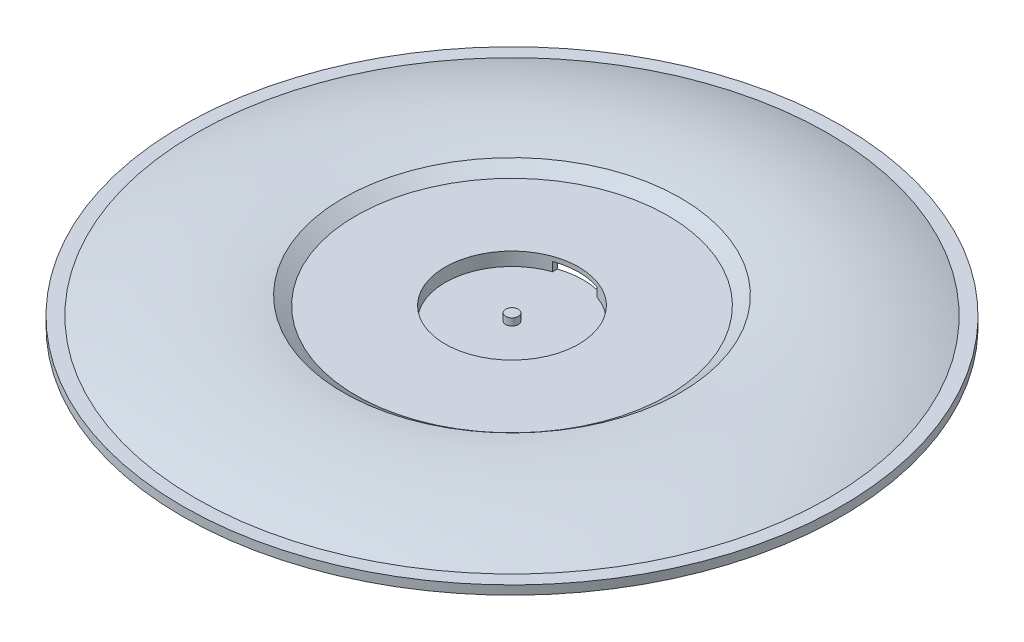
ISO-10303-21;
HEADER;
FILE_DESCRIPTION(('STEP AP214'),'2;1');
FILE_NAME('part.step','',(''),(''),'','','');
FILE_SCHEMA(('AUTOMOTIVE_DESIGN { 1 0 10303 214 1 1 1 1 }'));
ENDSEC;
DATA;
#1=APPLICATION_CONTEXT('core data for automotive mechanical design processes');
#2=APPLICATION_PROTOCOL_DEFINITION('international standard','automotive_design',2000,#1);
#3=PRODUCT_CONTEXT('',#1,'mechanical');
#4=PRODUCT('Part','Part','',(#3));
#5=PRODUCT_RELATED_PRODUCT_CATEGORY('part','',(#4));
#6=PRODUCT_DEFINITION_FORMATION('','',#4);
#7=PRODUCT_DEFINITION_CONTEXT('part definition',#1,'design');
#8=PRODUCT_DEFINITION('design','',#6,#7);
#9=PRODUCT_DEFINITION_SHAPE('','',#8);
#10=(LENGTH_UNIT() NAMED_UNIT(*) SI_UNIT(.MILLI.,.METRE.));
#11=(NAMED_UNIT(*) PLANE_ANGLE_UNIT() SI_UNIT($,.RADIAN.));
#12=(NAMED_UNIT(*) SI_UNIT($,.STERADIAN.) SOLID_ANGLE_UNIT());
#13=UNCERTAINTY_MEASURE_WITH_UNIT(LENGTH_MEASURE(1.E-05),#10,'distance_accuracy_value','');
#14=(GEOMETRIC_REPRESENTATION_CONTEXT(3) GLOBAL_UNCERTAINTY_ASSIGNED_CONTEXT((#13)) GLOBAL_UNIT_ASSIGNED_CONTEXT((#10,
#11,#12)) REPRESENTATION_CONTEXT('',''));
#15=CARTESIAN_POINT('',(0.,0.,0.));
#16=DIRECTION('',(0.,0.,1.));
#17=DIRECTION('',(1.,0.,0.));
#18=AXIS2_PLACEMENT_3D('',#15,#16,#17);
#19=CARTESIAN_POINT('',(0.,0.5,0.));
#20=DIRECTION('',(0.,1.,0.));
#21=DIRECTION('',(0.,0.,1.));
#22=AXIS2_PLACEMENT_3D('',#19,#20,#21);
#23=PLANE('',#22);
#24=CARTESIAN_POINT('',(0.,0.5,0.));
#25=DIRECTION('',(0.,1.,0.));
#26=DIRECTION('',(0.,0.,1.));
#27=AXIS2_PLACEMENT_3D('',#24,#25,#26);
#28=CIRCLE('',#27,0.7);
#29=CARTESIAN_POINT('',(0.,0.5,0.7));
#30=VERTEX_POINT('',#29);
#31=EDGE_CURVE('E11',#30,#30,#28,.T.);
#32=ORIENTED_EDGE('',*,*,#31,.F.);
#33=EDGE_LOOP('',(#32));
#34=FACE_BOUND('',#33,.T.);
#35=CARTESIAN_POINT('',(0.,0.5,0.));
#36=DIRECTION('',(0.,-1.,0.));
#37=DIRECTION('',(0.,0.,-1.));
#38=AXIS2_PLACEMENT_3D('',#35,#36,#37);
#39=CIRCLE('',#38,7.5);
#40=CARTESIAN_POINT('',(-2.50000000000001,0.5,7.07106781186549));
#41=VERTEX_POINT('',#40);
#42=CARTESIAN_POINT('',(-2.50000000000001,0.5,-7.07106781186549));
#43=VERTEX_POINT('',#42);
#44=EDGE_CURVE('E179',#41,#43,#39,.T.);
#45=ORIENTED_EDGE('',*,*,#44,.F.);
#46=DIRECTION('',(0.,0.,1.));
#47=VECTOR('',#46,1.);
#48=CARTESIAN_POINT('',(-2.5,0.5,-15.));
#49=LINE('',#48,#47);
#50=CARTESIAN_POINT('',(-2.5,0.5,7.59934207678534));
#51=VERTEX_POINT('',#50);
#52=EDGE_CURVE('E214',#41,#51,#49,.T.);
#53=ORIENTED_EDGE('',*,*,#52,.T.);
#54=CARTESIAN_POINT('',(0.,0.5,0.));
#55=DIRECTION('',(0.,-1.,0.));
#56=DIRECTION('',(0.,0.,-1.));
#57=AXIS2_PLACEMENT_3D('',#54,#55,#56);
#58=CIRCLE('',#57,8.);
#59=CARTESIAN_POINT('',(2.50000000000001,0.5,7.59934207678534));
#60=VERTEX_POINT('',#59);
#61=EDGE_CURVE('E187',#51,#60,#58,.F.);
#62=ORIENTED_EDGE('',*,*,#61,.T.);
#63=DIRECTION('',(0.,0.,1.));
#64=VECTOR('',#63,1.);
#65=CARTESIAN_POINT('',(2.5,0.5,-15.));
#66=LINE('',#65,#64);
#67=CARTESIAN_POINT('',(2.50000000000001,0.5,7.07106781186549));
#68=VERTEX_POINT('',#67);
#69=EDGE_CURVE('E213',#68,#60,#66,.T.);
#70=ORIENTED_EDGE('',*,*,#69,.F.);
#71=CARTESIAN_POINT('',(2.50000000000001,0.5,-7.07106781186549));
#72=VERTEX_POINT('',#71);
#73=EDGE_CURVE('E180',#72,#68,#39,.T.);
#74=ORIENTED_EDGE('',*,*,#73,.F.);
#75=CARTESIAN_POINT('',(2.5,0.5,-7.59934207678534));
#76=VERTEX_POINT('',#75);
#77=EDGE_CURVE('E208',#76,#72,#66,.T.);
#78=ORIENTED_EDGE('',*,*,#77,.F.);
#79=CARTESIAN_POINT('',(-2.50000000000001,0.5,-7.59934207678534));
#80=VERTEX_POINT('',#79);
#81=EDGE_CURVE('E119',#76,#80,#58,.F.);
#82=ORIENTED_EDGE('',*,*,#81,.T.);
#83=EDGE_CURVE('E205',#80,#43,#49,.T.);
#84=ORIENTED_EDGE('',*,*,#83,.T.);
#85=EDGE_LOOP('',(#45,#53,#62,#70,#74,#78,#82,#84));
#86=FACE_BOUND('',#85,.T.);
#87=ADVANCED_FACE('F40',(#34,#86),#23,.T.);
#88=CARTESIAN_POINT('',(0.,0.,0.));
#89=DIRECTION('',(0.,-1.,0.));
#90=DIRECTION('',(0.,0.,-1.));
#91=AXIS2_PLACEMENT_3D('',#88,#89,#90);
#92=CYLINDRICAL_SURFACE('',#91,7.5);
#93=DIRECTION('',(0.,-1.,0.));
#94=VECTOR('',#93,1.);
#95=CARTESIAN_POINT('',(2.50000000000001,0.,-7.07106781186549));
#96=LINE('',#95,#94);
#97=CARTESIAN_POINT('',(2.50000000000001,1.5,-7.07106781186549));
#98=VERTEX_POINT('',#97);
#99=EDGE_CURVE('E106',#72,#98,#96,.F.);
#100=ORIENTED_EDGE('',*,*,#99,.F.);
#101=ORIENTED_EDGE('',*,*,#73,.T.);
#102=DIRECTION('',(0.,-1.,0.));
#103=VECTOR('',#102,1.);
#104=CARTESIAN_POINT('',(2.50000000000001,0.,7.07106781186549));
#105=LINE('',#104,#103);
#106=CARTESIAN_POINT('',(2.50000000000001,1.5,7.07106781186549));
#107=VERTEX_POINT('',#106);
#108=EDGE_CURVE('E239',#107,#68,#105,.T.);
#109=ORIENTED_EDGE('',*,*,#108,.F.);
#110=CARTESIAN_POINT('',(0.,1.5,0.));
#111=DIRECTION('',(0.,1.,0.));
#112=DIRECTION('',(0.,0.,1.));
#113=AXIS2_PLACEMENT_3D('',#110,#111,#112);
#114=CIRCLE('',#113,7.5);
#115=CARTESIAN_POINT('',(-2.50000000000001,1.5,7.07106781186549));
#116=VERTEX_POINT('',#115);
#117=EDGE_CURVE('E230',#116,#107,#114,.T.);
#118=ORIENTED_EDGE('',*,*,#117,.F.);
#119=DIRECTION('',(0.,-1.,0.));
#120=VECTOR('',#119,1.);
#121=CARTESIAN_POINT('',(-2.50000000000001,0.,7.07106781186549));
#122=LINE('',#121,#120);
#123=EDGE_CURVE('E233',#41,#116,#122,.F.);
#124=ORIENTED_EDGE('',*,*,#123,.F.);
#125=ORIENTED_EDGE('',*,*,#44,.T.);
#126=DIRECTION('',(0.,-1.,0.));
#127=VECTOR('',#126,1.);
#128=CARTESIAN_POINT('',(-2.50000000000001,0.,-7.07106781186549));
#129=LINE('',#128,#127);
#130=CARTESIAN_POINT('',(-2.50000000000001,1.5,-7.07106781186549));
#131=VERTEX_POINT('',#130);
#132=EDGE_CURVE('E211',#131,#43,#129,.T.);
#133=ORIENTED_EDGE('',*,*,#132,.F.);
#134=EDGE_CURVE('E219',#98,#131,#114,.T.);
#135=ORIENTED_EDGE('',*,*,#134,.F.);
#136=EDGE_LOOP('',(#100,#101,#109,#118,#124,#125,#133,#135));
#137=FACE_BOUND('',#136,.T.);
#138=CARTESIAN_POINT('',(0.,2.,0.));
#139=DIRECTION('',(0.,-1.,0.));
#140=DIRECTION('',(0.,0.,-1.));
#141=AXIS2_PLACEMENT_3D('',#138,#139,#140);
#142=CIRCLE('',#141,7.5);
#143=CARTESIAN_POINT('',(0.,2.,-7.5));
#144=VERTEX_POINT('',#143);
#145=EDGE_CURVE('E175',#144,#144,#142,.T.);
#146=ORIENTED_EDGE('',*,*,#145,.F.);
#147=EDGE_LOOP('',(#146));
#148=FACE_BOUND('',#147,.T.);
#149=ADVANCED_FACE('F263',(#137,#148),#92,.F.);
#150=CARTESIAN_POINT('',(7.50000000000001,2.,0.));
#151=DIRECTION('',(0.,1.,0.));
#152=DIRECTION('',(0.,0.,1.));
#153=AXIS2_PLACEMENT_3D('',#150,#151,#152);
#154=PLANE('',#153);
#155=ORIENTED_EDGE('',*,*,#145,.T.);
#156=EDGE_LOOP('',(#155));
#157=FACE_BOUND('',#156,.T.);
#158=CARTESIAN_POINT('',(0.,2.,0.));
#159=DIRECTION('',(0.,-1.,0.));
#160=DIRECTION('',(0.,0.,-1.));
#161=AXIS2_PLACEMENT_3D('',#158,#159,#160);
#162=CIRCLE('',#161,17.5);
#163=CARTESIAN_POINT('',(0.,2.,-17.5));
#164=VERTEX_POINT('',#163);
#165=EDGE_CURVE('E171',#164,#164,#162,.T.);
#166=ORIENTED_EDGE('',*,*,#165,.F.);
#167=EDGE_LOOP('',(#166));
#168=FACE_BOUND('',#167,.T.);
#169=ADVANCED_FACE('F268',(#157,#168),#154,.T.);
#170=CARTESIAN_POINT('',(0.,3.,0.));
#171=DIRECTION('',(0.,1.,0.));
#172=DIRECTION('',(0.,0.,1.));
#173=AXIS2_PLACEMENT_3D('',#170,#171,#172);
#174=CONICAL_SURFACE('',#173,18.9281480067421,0.95993108859688);
#175=ORIENTED_EDGE('',*,*,#165,.T.);
#176=EDGE_LOOP('',(#175));
#177=FACE_BOUND('',#176,.T.);
#178=CARTESIAN_POINT('',(0.,3.,0.));
#179=DIRECTION('',(0.,-1.,0.));
#180=DIRECTION('',(0.,0.,-1.));
#181=AXIS2_PLACEMENT_3D('',#178,#179,#180);
#182=CIRCLE('',#181,18.9281480067421);
#183=CARTESIAN_POINT('',(0.,3.,-18.9281480067421));
#184=VERTEX_POINT('',#183);
#185=EDGE_CURVE('E167',#184,#184,#182,.T.);
#186=ORIENTED_EDGE('',*,*,#185,.F.);
#187=EDGE_LOOP('',(#186));
#188=FACE_BOUND('',#187,.T.);
#189=ADVANCED_FACE('F447',(#177,#188),#174,.F.);
#190=CARTESIAN_POINT('',(0.,-29.6971542186464,0.));
#191=DIRECTION('',(0.,-1.,0.));
#192=DIRECTION('',(0.,0.,-1.));
#193=AXIS2_PLACEMENT_3D('',#190,#191,#192);
#194=DEGENERATE_TOROIDAL_SURFACE('',#193,23.3886531353182,33.,.T.);
#195=ORIENTED_EDGE('',*,*,#185,.T.);
#196=EDGE_LOOP('',(#195));
#197=FACE_BOUND('',#196,.T.);
#198=CARTESIAN_POINT('',(0.,1.00000000000001,0.));
#199=DIRECTION('',(0.,-1.,0.));
#200=DIRECTION('',(0.,0.,-1.));
#201=AXIS2_PLACEMENT_3D('',#198,#199,#200);
#202=CIRCLE('',#201,35.5);
#203=CARTESIAN_POINT('',(0.,1.00000000000001,-35.5));
#204=VERTEX_POINT('',#203);
#205=EDGE_CURVE('E163',#204,#204,#202,.T.);
#206=ORIENTED_EDGE('',*,*,#205,.F.);
#207=EDGE_LOOP('',(#206));
#208=FACE_BOUND('',#207,.T.);
#209=ADVANCED_FACE('F437',(#197,#208),#194,.T.);
#210=CARTESIAN_POINT('',(35.5000000000001,1.,0.));
#211=DIRECTION('',(0.,1.,0.));
#212=DIRECTION('',(0.,0.,1.));
#213=AXIS2_PLACEMENT_3D('',#210,#211,#212);
#214=PLANE('',#213);
#215=ORIENTED_EDGE('',*,*,#205,.T.);
#216=EDGE_LOOP('',(#215));
#217=FACE_BOUND('',#216,.T.);
#218=CARTESIAN_POINT('',(0.,1.,0.));
#219=DIRECTION('',(0.,-1.,0.));
#220=DIRECTION('',(0.,0.,-1.));
#221=AXIS2_PLACEMENT_3D('',#218,#219,#220);
#222=CIRCLE('',#221,37.);
#223=CARTESIAN_POINT('',(0.,1.,-37.));
#224=VERTEX_POINT('',#223);
#225=EDGE_CURVE('E159',#224,#224,#222,.T.);
#226=ORIENTED_EDGE('',*,*,#225,.F.);
#227=EDGE_LOOP('',(#226));
#228=FACE_BOUND('',#227,.T.);
#229=ADVANCED_FACE('F427',(#217,#228),#214,.T.);
#230=CARTESIAN_POINT('',(0.,0.,0.));
#231=DIRECTION('',(0.,-1.,0.));
#232=DIRECTION('',(0.,0.,-1.));
#233=AXIS2_PLACEMENT_3D('',#230,#231,#232);
#234=CYLINDRICAL_SURFACE('',#233,37.);
#235=ORIENTED_EDGE('',*,*,#225,.T.);
#236=EDGE_LOOP('',(#235));
#237=FACE_BOUND('',#236,.T.);
#238=CARTESIAN_POINT('',(0.,0.,0.));
#239=DIRECTION('',(0.,-1.,0.));
#240=DIRECTION('',(0.,0.,-1.));
#241=AXIS2_PLACEMENT_3D('',#238,#239,#240);
#242=CIRCLE('',#241,37.);
#243=CARTESIAN_POINT('',(0.,0.,-37.));
#244=VERTEX_POINT('',#243);
#245=EDGE_CURVE('E155',#244,#244,#242,.T.);
#246=ORIENTED_EDGE('',*,*,#245,.F.);
#247=EDGE_LOOP('',(#246));
#248=FACE_BOUND('',#247,.T.);
#249=ADVANCED_FACE('F417',(#237,#248),#234,.T.);
#250=CARTESIAN_POINT('',(37.,0.,0.));
#251=DIRECTION('',(0.,-1.,0.));
#252=DIRECTION('',(0.,0.,-1.));
#253=AXIS2_PLACEMENT_3D('',#250,#251,#252);
#254=PLANE('',#253);
#255=ORIENTED_EDGE('',*,*,#245,.T.);
#256=EDGE_LOOP('',(#255));
#257=FACE_BOUND('',#256,.T.);
#258=CARTESIAN_POINT('',(0.,0.,0.));
#259=DIRECTION('',(0.,-1.,0.));
#260=DIRECTION('',(0.,0.,-1.));
#261=AXIS2_PLACEMENT_3D('',#258,#259,#260);
#262=CIRCLE('',#261,36.5);
#263=CARTESIAN_POINT('',(0.,0.,-36.5));
#264=VERTEX_POINT('',#263);
#265=EDGE_CURVE('E151',#264,#264,#262,.T.);
#266=ORIENTED_EDGE('',*,*,#265,.F.);
#267=EDGE_LOOP('',(#266));
#268=FACE_BOUND('',#267,.T.);
#269=ADVANCED_FACE('F407',(#257,#268),#254,.T.);
#270=CARTESIAN_POINT('',(0.,0.,0.));
#271=DIRECTION('',(0.,-1.,0.));
#272=DIRECTION('',(0.,0.,-1.));
#273=AXIS2_PLACEMENT_3D('',#270,#271,#272);
#274=CYLINDRICAL_SURFACE('',#273,36.5);
#275=ORIENTED_EDGE('',*,*,#265,.T.);
#276=EDGE_LOOP('',(#275));
#277=FACE_BOUND('',#276,.T.);
#278=CARTESIAN_POINT('',(0.,0.5,0.));
#279=DIRECTION('',(0.,-1.,0.));
#280=DIRECTION('',(0.,0.,-1.));
#281=AXIS2_PLACEMENT_3D('',#278,#279,#280);
#282=CIRCLE('',#281,36.5);
#283=CARTESIAN_POINT('',(0.,0.5,-36.5));
#284=VERTEX_POINT('',#283);
#285=EDGE_CURVE('E147',#284,#284,#282,.T.);
#286=ORIENTED_EDGE('',*,*,#285,.F.);
#287=EDGE_LOOP('',(#286));
#288=FACE_BOUND('',#287,.T.);
#289=ADVANCED_FACE('F397',(#277,#288),#274,.F.);
#290=CARTESIAN_POINT('',(35.404554145866,0.5,0.));
#291=DIRECTION('',(0.,-1.,0.));
#292=DIRECTION('',(0.,0.,-1.));
#293=AXIS2_PLACEMENT_3D('',#290,#291,#292);
#294=PLANE('',#293);
#295=ORIENTED_EDGE('',*,*,#285,.T.);
#296=EDGE_LOOP('',(#295));
#297=FACE_BOUND('',#296,.T.);
#298=CARTESIAN_POINT('',(0.,0.5,0.));
#299=DIRECTION('',(0.,-1.,0.));
#300=DIRECTION('',(0.,0.,-1.));
#301=AXIS2_PLACEMENT_3D('',#298,#299,#300);
#302=CIRCLE('',#301,35.404554145866);
#303=CARTESIAN_POINT('',(0.,0.5,-35.404554145866));
#304=VERTEX_POINT('',#303);
#305=EDGE_CURVE('E143',#304,#304,#302,.T.);
#306=ORIENTED_EDGE('',*,*,#305,.F.);
#307=EDGE_LOOP('',(#306));
#308=FACE_BOUND('',#307,.T.);
#309=ADVANCED_FACE('F387',(#297,#308),#294,.T.);
#310=CARTESIAN_POINT('',(0.,-29.6971542186464,0.));
#311=DIRECTION('',(0.,-1.,0.));
#312=DIRECTION('',(0.,0.,-1.));
#313=AXIS2_PLACEMENT_3D('',#310,#311,#312);
#314=DEGENERATE_TOROIDAL_SURFACE('',#313,23.3886531353182,32.5,.T.);
#315=ORIENTED_EDGE('',*,*,#305,.T.);
#316=EDGE_LOOP('',(#315));
#317=FACE_BOUND('',#316,.T.);
#318=CARTESIAN_POINT('',(0.,2.52067771160669,0.));
#319=DIRECTION('',(0.,-1.,0.));
#320=DIRECTION('',(0.,0.,-1.));
#321=AXIS2_PLACEMENT_3D('',#318,#319,#320);
#322=CIRCLE('',#321,19.1153282337967);
#323=CARTESIAN_POINT('',(0.,2.52067771160669,-19.1153282337967));
#324=VERTEX_POINT('',#323);
#325=EDGE_CURVE('E133',#324,#324,#322,.T.);
#326=ORIENTED_EDGE('',*,*,#325,.F.);
#327=EDGE_LOOP('',(#326));
#328=FACE_BOUND('',#327,.T.);
#329=ADVANCED_FACE('F378',(#317,#328),#314,.F.);
#330=CARTESIAN_POINT('',(0.,1.5,0.));
#331=DIRECTION('',(0.,1.,0.));
#332=DIRECTION('',(0.,0.,1.));
#333=AXIS2_PLACEMENT_3D('',#330,#331,#332);
#334=CONICAL_SURFACE('',#333,17.6576493944395,0.959931088596881);
#335=ORIENTED_EDGE('',*,*,#325,.T.);
#336=EDGE_LOOP('',(#335));
#337=FACE_BOUND('',#336,.T.);
#338=CARTESIAN_POINT('',(0.,1.5,0.));
#339=DIRECTION('',(0.,-1.,0.));
#340=DIRECTION('',(0.,0.,-1.));
#341=AXIS2_PLACEMENT_3D('',#338,#339,#340);
#342=CIRCLE('',#341,17.6576493944395);
#343=CARTESIAN_POINT('',(0.,1.5,-17.6576493944395));
#344=VERTEX_POINT('',#343);
#345=EDGE_CURVE('E126',#344,#344,#342,.T.);
#346=ORIENTED_EDGE('',*,*,#345,.F.);
#347=EDGE_LOOP('',(#346));
#348=FACE_BOUND('',#347,.T.);
#349=ADVANCED_FACE('F260',(#337,#348),#334,.T.);
#350=CARTESIAN_POINT('',(8.,1.5,0.));
#351=DIRECTION('',(0.,-1.,0.));
#352=DIRECTION('',(0.,0.,-1.));
#353=AXIS2_PLACEMENT_3D('',#350,#351,#352);
#354=PLANE('',#353);
#355=CARTESIAN_POINT('',(0.,1.5,0.));
#356=DIRECTION('',(0.,-1.,0.));
#357=DIRECTION('',(0.,0.,-1.));
#358=AXIS2_PLACEMENT_3D('',#355,#356,#357);
#359=CIRCLE('',#358,8.);
#360=CARTESIAN_POINT('',(2.5,1.5,-7.59934207678534));
#361=VERTEX_POINT('',#360);
#362=CARTESIAN_POINT('',(2.50000000000001,1.5,7.59934207678534));
#363=VERTEX_POINT('',#362);
#364=EDGE_CURVE('E117',#361,#363,#359,.T.);
#365=ORIENTED_EDGE('',*,*,#364,.F.);
#366=DIRECTION('',(0.,0.,1.));
#367=VECTOR('',#366,1.);
#368=CARTESIAN_POINT('',(2.50000000000001,1.5,-15.));
#369=LINE('',#368,#367);
#370=EDGE_CURVE('E55',#361,#98,#369,.T.);
#371=ORIENTED_EDGE('',*,*,#370,.T.);
#372=ORIENTED_EDGE('',*,*,#134,.T.);
#373=DIRECTION('',(0.,0.,1.));
#374=VECTOR('',#373,1.);
#375=CARTESIAN_POINT('',(-2.5,1.5,-15.));
#376=LINE('',#375,#374);
#377=CARTESIAN_POINT('',(-2.50000000000001,1.5,-7.59934207678534));
#378=VERTEX_POINT('',#377);
#379=EDGE_CURVE('E218',#378,#131,#376,.T.);
#380=ORIENTED_EDGE('',*,*,#379,.F.);
#381=CARTESIAN_POINT('',(-2.5,1.5,7.59934207678534));
#382=VERTEX_POINT('',#381);
#383=EDGE_CURVE('E127',#382,#378,#359,.T.);
#384=ORIENTED_EDGE('',*,*,#383,.F.);
#385=EDGE_CURVE('E62',#116,#382,#376,.T.);
#386=ORIENTED_EDGE('',*,*,#385,.F.);
#387=ORIENTED_EDGE('',*,*,#117,.T.);
#388=EDGE_CURVE('E109',#107,#363,#369,.T.);
#389=ORIENTED_EDGE('',*,*,#388,.T.);
#390=EDGE_LOOP('',(#365,#371,#372,#380,#384,#386,#387,#389));
#391=FACE_BOUND('',#390,.T.);
#392=ORIENTED_EDGE('',*,*,#345,.T.);
#393=EDGE_LOOP('',(#392));
#394=FACE_BOUND('',#393,.T.);
#395=ADVANCED_FACE('F121',(#391,#394),#354,.T.);
#396=CARTESIAN_POINT('',(0.,0.,0.));
#397=DIRECTION('',(0.,-1.,0.));
#398=DIRECTION('',(0.,0.,-1.));
#399=AXIS2_PLACEMENT_3D('',#396,#397,#398);
#400=CYLINDRICAL_SURFACE('',#399,8.);
#401=DIRECTION('',(0.,-1.,0.));
#402=VECTOR('',#401,1.);
#403=CARTESIAN_POINT('',(2.5,0.,-7.59934207678534));
#404=LINE('',#403,#402);
#405=EDGE_CURVE('E48',#361,#76,#404,.T.);
#406=ORIENTED_EDGE('',*,*,#405,.F.);
#407=ORIENTED_EDGE('',*,*,#364,.T.);
#408=DIRECTION('',(0.,-1.,0.));
#409=VECTOR('',#408,1.);
#410=CARTESIAN_POINT('',(2.50000000000001,0.,7.59934207678534));
#411=LINE('',#410,#409);
#412=EDGE_CURVE('E190',#60,#363,#411,.F.);
#413=ORIENTED_EDGE('',*,*,#412,.F.);
#414=ORIENTED_EDGE('',*,*,#61,.F.);
#415=DIRECTION('',(0.,-1.,0.));
#416=VECTOR('',#415,1.);
#417=CARTESIAN_POINT('',(-2.5,0.,7.59934207678534));
#418=LINE('',#417,#416);
#419=EDGE_CURVE('E184',#382,#51,#418,.T.);
#420=ORIENTED_EDGE('',*,*,#419,.F.);
#421=ORIENTED_EDGE('',*,*,#383,.T.);
#422=DIRECTION('',(0.,-1.,0.));
#423=VECTOR('',#422,1.);
#424=CARTESIAN_POINT('',(-2.50000000000001,0.,-7.59934207678534));
#425=LINE('',#424,#423);
#426=EDGE_CURVE('E193',#80,#378,#425,.F.);
#427=ORIENTED_EDGE('',*,*,#426,.F.);
#428=ORIENTED_EDGE('',*,*,#81,.F.);
#429=EDGE_LOOP('',(#406,#407,#413,#414,#420,#421,#427,#428));
#430=FACE_BOUND('',#429,.T.);
#431=CARTESIAN_POINT('',(0.,0.,0.));
#432=DIRECTION('',(0.,-1.,0.));
#433=DIRECTION('',(0.,0.,-1.));
#434=AXIS2_PLACEMENT_3D('',#431,#432,#433);
#435=CIRCLE('',#434,8.);
#436=CARTESIAN_POINT('',(0.,0.,-8.));
#437=VERTEX_POINT('',#436);
#438=EDGE_CURVE('E136',#437,#437,#435,.T.);
#439=ORIENTED_EDGE('',*,*,#438,.F.);
#440=EDGE_LOOP('',(#439));
#441=FACE_BOUND('',#440,.T.);
#442=ADVANCED_FACE('F114',(#430,#441),#400,.T.);
#443=CARTESIAN_POINT('',(0.,0.,0.));
#444=DIRECTION('',(0.,-1.,0.));
#445=DIRECTION('',(0.,0.,-1.));
#446=AXIS2_PLACEMENT_3D('',#443,#444,#445);
#447=PLANE('',#446);
#448=ORIENTED_EDGE('',*,*,#438,.T.);
#449=EDGE_LOOP('',(#448));
#450=FACE_BOUND('',#449,.T.);
#451=ADVANCED_FACE('F251',(#450),#447,.T.);
#452=CARTESIAN_POINT('',(-2.5,0.5,-15.));
#453=DIRECTION('',(-1.,0.,0.));
#454=DIRECTION('',(0.,0.,1.));
#455=AXIS2_PLACEMENT_3D('',#452,#453,#454);
#456=PLANE('',#455);
#457=ORIENTED_EDGE('',*,*,#123,.T.);
#458=ORIENTED_EDGE('',*,*,#385,.T.);
#459=ORIENTED_EDGE('',*,*,#419,.T.);
#460=ORIENTED_EDGE('',*,*,#52,.F.);
#461=EDGE_LOOP('',(#457,#458,#459,#460));
#462=FACE_BOUND('',#461,.T.);
#463=ADVANCED_FACE('F258',(#462),#456,.F.);
#464=CARTESIAN_POINT('',(2.5,0.5,-15.));
#465=DIRECTION('',(1.,0.,0.));
#466=DIRECTION('',(0.,1.,0.));
#467=AXIS2_PLACEMENT_3D('',#464,#465,#466);
#468=PLANE('',#467);
#469=ORIENTED_EDGE('',*,*,#108,.T.);
#470=ORIENTED_EDGE('',*,*,#69,.T.);
#471=ORIENTED_EDGE('',*,*,#412,.T.);
#472=ORIENTED_EDGE('',*,*,#388,.F.);
#473=EDGE_LOOP('',(#469,#470,#471,#472));
#474=FACE_BOUND('',#473,.T.);
#475=ADVANCED_FACE('F286',(#474),#468,.F.);
#476=ORIENTED_EDGE('',*,*,#132,.T.);
#477=ORIENTED_EDGE('',*,*,#83,.F.);
#478=ORIENTED_EDGE('',*,*,#426,.T.);
#479=ORIENTED_EDGE('',*,*,#379,.T.);
#480=EDGE_LOOP('',(#476,#477,#478,#479));
#481=FACE_BOUND('',#480,.T.);
#482=ADVANCED_FACE('F209',(#481),#456,.F.);
#483=ORIENTED_EDGE('',*,*,#99,.T.);
#484=ORIENTED_EDGE('',*,*,#370,.F.);
#485=ORIENTED_EDGE('',*,*,#405,.T.);
#486=ORIENTED_EDGE('',*,*,#77,.T.);
#487=EDGE_LOOP('',(#483,#484,#485,#486));
#488=FACE_BOUND('',#487,.T.);
#489=ADVANCED_FACE('F103',(#488),#468,.F.);
#490=CARTESIAN_POINT('',(0.,1.3,0.));
#491=DIRECTION('',(0.,1.,0.));
#492=DIRECTION('',(0.,0.,1.));
#493=AXIS2_PLACEMENT_3D('',#490,#491,#492);
#494=PLANE('',#493);
#495=CARTESIAN_POINT('',(0.,1.3,0.));
#496=DIRECTION('',(0.,-1.,0.));
#497=DIRECTION('',(0.,0.,-1.));
#498=AXIS2_PLACEMENT_3D('',#495,#496,#497);
#499=CIRCLE('',#498,0.7);
#500=CARTESIAN_POINT('',(0.,1.3,-0.7));
#501=VERTEX_POINT('',#500);
#502=EDGE_CURVE('E229',#501,#501,#499,.T.);
#503=ORIENTED_EDGE('',*,*,#502,.F.);
#504=EDGE_LOOP('',(#503));
#505=FACE_BOUND('',#504,.T.);
#506=ADVANCED_FACE('F274',(#505),#494,.T.);
#507=CARTESIAN_POINT('',(0.,0.5,0.));
#508=DIRECTION('',(0.,-1.,0.));
#509=DIRECTION('',(0.,0.,-1.));
#510=AXIS2_PLACEMENT_3D('',#507,#508,#509);
#511=CYLINDRICAL_SURFACE('',#510,0.7);
#512=ORIENTED_EDGE('',*,*,#502,.T.);
#513=EDGE_LOOP('',(#512));
#514=FACE_BOUND('',#513,.T.);
#515=ORIENTED_EDGE('',*,*,#31,.T.);
#516=EDGE_LOOP('',(#515));
#517=FACE_BOUND('',#516,.T.);
#518=ADVANCED_FACE('F272',(#514,#517),#511,.T.);
#519=CLOSED_SHELL('',(#87,#149,#169,#189,#209,#229,#249,#269,#289,#309,#329,#349,#395,#442,#451,
#463,#475,#482,#489,#506,#518));
#520=MANIFOLD_SOLID_BREP('B2',#519);
#521=ADVANCED_BREP_SHAPE_REPRESENTATION('',(#18,#520),#14);
#522=SHAPE_DEFINITION_REPRESENTATION(#9,#521);
ENDSEC;
END-ISO-10303-21;
